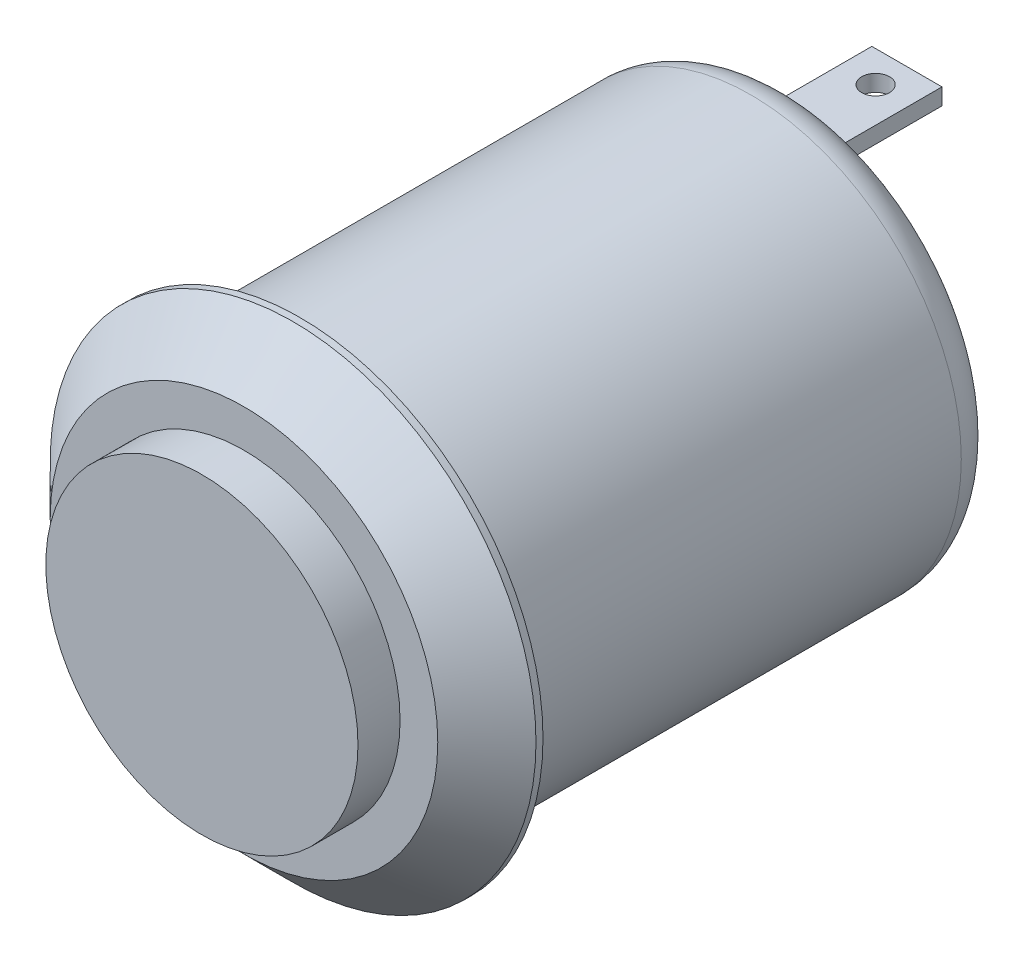
ISO-10303-21;
HEADER;
FILE_DESCRIPTION(('STEP AP214'),'2;1');
FILE_NAME('part.step','',(''),(''),'','','');
FILE_SCHEMA(('AUTOMOTIVE_DESIGN { 1 0 10303 214 1 1 1 1 }'));
ENDSEC;
DATA;
#1=APPLICATION_CONTEXT('core data for automotive mechanical design processes');
#2=APPLICATION_PROTOCOL_DEFINITION('international standard','automotive_design',2000,#1);
#3=PRODUCT_CONTEXT('',#1,'mechanical');
#4=PRODUCT('Part','Part','',(#3));
#5=PRODUCT_RELATED_PRODUCT_CATEGORY('part','',(#4));
#6=PRODUCT_DEFINITION_FORMATION('','',#4);
#7=PRODUCT_DEFINITION_CONTEXT('part definition',#1,'design');
#8=PRODUCT_DEFINITION('design','',#6,#7);
#9=PRODUCT_DEFINITION_SHAPE('','',#8);
#10=(LENGTH_UNIT() NAMED_UNIT(*) SI_UNIT(.MILLI.,.METRE.));
#11=(NAMED_UNIT(*) PLANE_ANGLE_UNIT() SI_UNIT($,.RADIAN.));
#12=(NAMED_UNIT(*) SI_UNIT($,.STERADIAN.) SOLID_ANGLE_UNIT());
#13=UNCERTAINTY_MEASURE_WITH_UNIT(LENGTH_MEASURE(1.E-05),#10,'distance_accuracy_value','');
#14=(GEOMETRIC_REPRESENTATION_CONTEXT(3) GLOBAL_UNCERTAINTY_ASSIGNED_CONTEXT((#13)) GLOBAL_UNIT_ASSIGNED_CONTEXT((#10,
#11,#12)) REPRESENTATION_CONTEXT('',''));
#15=CARTESIAN_POINT('',(0.,0.,0.));
#16=DIRECTION('',(0.,0.,1.));
#17=DIRECTION('',(1.,0.,0.));
#18=AXIS2_PLACEMENT_3D('',#15,#16,#17);
#19=CARTESIAN_POINT('',(0.,0.,-14.));
#20=DIRECTION('',(0.,0.,1.));
#21=DIRECTION('',(1.,0.,0.));
#22=AXIS2_PLACEMENT_3D('',#19,#20,#21);
#23=PLANE('',#22);
#24=DIRECTION('',(0.,1.,0.));
#25=VECTOR('',#24,1.);
#26=CARTESIAN_POINT('',(-1.,4.,-14.));
#27=LINE('',#26,#25);
#28=CARTESIAN_POINT('',(-1.,4.,-14.));
#29=VERTEX_POINT('',#28);
#30=CARTESIAN_POINT('',(-1.,4.47,-14.));
#31=VERTEX_POINT('',#30);
#32=EDGE_CURVE('E122',#29,#31,#27,.T.);
#33=ORIENTED_EDGE('',*,*,#32,.F.);
#34=DIRECTION('',(-1.,0.,0.));
#35=VECTOR('',#34,1.);
#36=CARTESIAN_POINT('',(1.,4.,-14.));
#37=LINE('',#36,#35);
#38=CARTESIAN_POINT('',(1.,4.,-14.));
#39=VERTEX_POINT('',#38);
#40=EDGE_CURVE('E135',#39,#29,#37,.T.);
#41=ORIENTED_EDGE('',*,*,#40,.F.);
#42=DIRECTION('',(0.,-1.,0.));
#43=VECTOR('',#42,1.);
#44=CARTESIAN_POINT('',(1.,4.,-14.));
#45=LINE('',#44,#43);
#46=CARTESIAN_POINT('',(1.,4.47,-14.));
#47=VERTEX_POINT('',#46);
#48=EDGE_CURVE('E144',#47,#39,#45,.T.);
#49=ORIENTED_EDGE('',*,*,#48,.F.);
#50=DIRECTION('',(1.,0.,0.));
#51=VECTOR('',#50,1.);
#52=CARTESIAN_POINT('',(1.,4.47,-14.));
#53=LINE('',#52,#51);
#54=EDGE_CURVE('E125',#31,#47,#53,.T.);
#55=ORIENTED_EDGE('',*,*,#54,.F.);
#56=EDGE_LOOP('',(#33,#41,#49,#55));
#57=FACE_BOUND('',#56,.T.);
#58=CARTESIAN_POINT('',(0.,0.,-14.));
#59=DIRECTION('',(0.,0.,1.));
#60=DIRECTION('',(1.,0.,0.));
#61=AXIS2_PLACEMENT_3D('',#58,#59,#60);
#62=CIRCLE('',#61,4.85);
#63=CARTESIAN_POINT('',(4.85,0.,-14.));
#64=VERTEX_POINT('',#63);
#65=EDGE_CURVE('E11',#64,#64,#62,.F.);
#66=ORIENTED_EDGE('',*,*,#65,.T.);
#67=EDGE_LOOP('',(#66));
#68=FACE_BOUND('',#67,.T.);
#69=DIRECTION('',(0.,-1.,0.));
#70=VECTOR('',#69,1.);
#71=CARTESIAN_POINT('',(1.,-4.,-14.));
#72=LINE('',#71,#70);
#73=CARTESIAN_POINT('',(1.,-4.,-14.));
#74=VERTEX_POINT('',#73);
#75=CARTESIAN_POINT('',(1.,-4.47,-14.));
#76=VERTEX_POINT('',#75);
#77=EDGE_CURVE('E121',#74,#76,#72,.T.);
#78=ORIENTED_EDGE('',*,*,#77,.F.);
#79=DIRECTION('',(1.,0.,0.));
#80=VECTOR('',#79,1.);
#81=CARTESIAN_POINT('',(1.,-4.,-14.));
#82=LINE('',#81,#80);
#83=CARTESIAN_POINT('',(-1.,-4.,-14.));
#84=VERTEX_POINT('',#83);
#85=EDGE_CURVE('E118',#84,#74,#82,.T.);
#86=ORIENTED_EDGE('',*,*,#85,.F.);
#87=DIRECTION('',(0.,1.,0.));
#88=VECTOR('',#87,1.);
#89=CARTESIAN_POINT('',(-1.,-4.,-14.));
#90=LINE('',#89,#88);
#91=CARTESIAN_POINT('',(-1.,-4.47,-14.));
#92=VERTEX_POINT('',#91);
#93=EDGE_CURVE('E56',#92,#84,#90,.T.);
#94=ORIENTED_EDGE('',*,*,#93,.F.);
#95=DIRECTION('',(-1.,0.,0.));
#96=VECTOR('',#95,1.);
#97=CARTESIAN_POINT('',(1.,-4.47,-14.));
#98=LINE('',#97,#96);
#99=EDGE_CURVE('E51',#76,#92,#98,.T.);
#100=ORIENTED_EDGE('',*,*,#99,.F.);
#101=EDGE_LOOP('',(#78,#86,#94,#100));
#102=FACE_BOUND('',#101,.T.);
#103=ADVANCED_FACE('F35',(#57,#68,#102),#23,.F.);
#104=CARTESIAN_POINT('',(0.,0.,-14.));
#105=DIRECTION('',(0.,0.,1.));
#106=DIRECTION('',(1.,0.,0.));
#107=AXIS2_PLACEMENT_3D('',#104,#105,#106);
#108=CYLINDRICAL_SURFACE('',#107,6.);
#109=CARTESIAN_POINT('',(0.,0.,-12.85));
#110=DIRECTION('',(0.,0.,1.));
#111=DIRECTION('',(1.,0.,0.));
#112=AXIS2_PLACEMENT_3D('',#109,#110,#111);
#113=CIRCLE('',#112,6.);
#114=CARTESIAN_POINT('',(6.,0.,-12.85));
#115=VERTEX_POINT('',#114);
#116=EDGE_CURVE('E44',#115,#115,#113,.T.);
#117=ORIENTED_EDGE('',*,*,#116,.T.);
#118=EDGE_LOOP('',(#117));
#119=FACE_BOUND('',#118,.T.);
#120=CARTESIAN_POINT('',(0.,0.,0.));
#121=DIRECTION('',(0.,0.,1.));
#122=DIRECTION('',(1.,0.,0.));
#123=AXIS2_PLACEMENT_3D('',#120,#121,#122);
#124=CIRCLE('',#123,6.);
#125=CARTESIAN_POINT('',(6.,0.,0.));
#126=VERTEX_POINT('',#125);
#127=EDGE_CURVE('E170',#126,#126,#124,.T.);
#128=ORIENTED_EDGE('',*,*,#127,.F.);
#129=EDGE_LOOP('',(#128));
#130=FACE_BOUND('',#129,.T.);
#131=ADVANCED_FACE('F181',(#119,#130),#108,.T.);
#132=CARTESIAN_POINT('',(0.,0.,1.6));
#133=DIRECTION('',(0.,0.,-1.));
#134=DIRECTION('',(-1.,0.,0.));
#135=AXIS2_PLACEMENT_3D('',#132,#133,#134);
#136=CYLINDRICAL_SURFACE('',#135,6.925);
#137=CARTESIAN_POINT('',(0.,0.,0.199999999999992));
#138=DIRECTION('',(0.,0.,1.));
#139=DIRECTION('',(1.,0.,0.));
#140=AXIS2_PLACEMENT_3D('',#137,#138,#139);
#141=CIRCLE('',#140,6.925);
#142=CARTESIAN_POINT('',(6.925,0.,0.199999999999992));
#143=VERTEX_POINT('',#142);
#144=EDGE_CURVE('E167',#143,#143,#141,.F.);
#145=ORIENTED_EDGE('',*,*,#144,.T.);
#146=EDGE_LOOP('',(#145));
#147=FACE_BOUND('',#146,.T.);
#148=CARTESIAN_POINT('',(0.,0.,0.));
#149=DIRECTION('',(0.,0.,1.));
#150=DIRECTION('',(1.,0.,0.));
#151=AXIS2_PLACEMENT_3D('',#148,#149,#150);
#152=CIRCLE('',#151,6.925);
#153=CARTESIAN_POINT('',(6.925,0.,0.));
#154=VERTEX_POINT('',#153);
#155=EDGE_CURVE('E163',#154,#154,#152,.T.);
#156=ORIENTED_EDGE('',*,*,#155,.T.);
#157=EDGE_LOOP('',(#156));
#158=FACE_BOUND('',#157,.T.);
#159=ADVANCED_FACE('F205',(#147,#158),#136,.T.);
#160=CARTESIAN_POINT('',(0.,0.,1.6));
#161=DIRECTION('',(0.,0.,1.));
#162=DIRECTION('',(1.,0.,0.));
#163=AXIS2_PLACEMENT_3D('',#160,#161,#162);
#164=PLANE('',#163);
#165=CARTESIAN_POINT('',(0.,0.,1.6));
#166=DIRECTION('',(0.,0.,1.));
#167=DIRECTION('',(1.,0.,0.));
#168=AXIS2_PLACEMENT_3D('',#165,#166,#167);
#169=CIRCLE('',#168,4.45);
#170=CARTESIAN_POINT('',(4.45,0.,1.6));
#171=VERTEX_POINT('',#170);
#172=EDGE_CURVE('E164',#171,#171,#169,.T.);
#173=ORIENTED_EDGE('',*,*,#172,.F.);
#174=EDGE_LOOP('',(#173));
#175=FACE_BOUND('',#174,.T.);
#176=CARTESIAN_POINT('',(0.,0.,1.6));
#177=DIRECTION('',(0.,0.,1.));
#178=DIRECTION('',(1.,0.,0.));
#179=AXIS2_PLACEMENT_3D('',#176,#177,#178);
#180=CIRCLE('',#179,5.52499999999999);
#181=CARTESIAN_POINT('',(5.52499999999999,0.,1.6));
#182=VERTEX_POINT('',#181);
#183=EDGE_CURVE('E173',#182,#182,#180,.T.);
#184=ORIENTED_EDGE('',*,*,#183,.T.);
#185=EDGE_LOOP('',(#184));
#186=FACE_BOUND('',#185,.T.);
#187=ADVANCED_FACE('F223',(#175,#186),#164,.T.);
#188=CARTESIAN_POINT('',(0.,0.,0.));
#189=DIRECTION('',(0.,0.,1.));
#190=DIRECTION('',(1.,0.,0.));
#191=AXIS2_PLACEMENT_3D('',#188,#189,#190);
#192=PLANE('',#191);
#193=ORIENTED_EDGE('',*,*,#127,.T.);
#194=EDGE_LOOP('',(#193));
#195=FACE_BOUND('',#194,.T.);
#196=ORIENTED_EDGE('',*,*,#155,.F.);
#197=EDGE_LOOP('',(#196));
#198=FACE_BOUND('',#197,.T.);
#199=ADVANCED_FACE('F215',(#195,#198),#192,.F.);
#200=CARTESIAN_POINT('',(0.,0.,1.6));
#201=DIRECTION('',(0.,0.,-1.));
#202=DIRECTION('',(-1.,0.,0.));
#203=AXIS2_PLACEMENT_3D('',#200,#201,#202);
#204=CONICAL_SURFACE('',#203,5.52499999999999,0.785398163397448);
#205=ORIENTED_EDGE('',*,*,#144,.F.);
#206=EDGE_LOOP('',(#205));
#207=FACE_BOUND('',#206,.T.);
#208=ORIENTED_EDGE('',*,*,#183,.F.);
#209=EDGE_LOOP('',(#208));
#210=FACE_BOUND('',#209,.T.);
#211=ADVANCED_FACE('F211',(#207,#210),#204,.T.);
#212=CARTESIAN_POINT('',(0.,0.,2.8));
#213=DIRECTION('',(0.,0.,-1.));
#214=DIRECTION('',(-1.,0.,0.));
#215=AXIS2_PLACEMENT_3D('',#212,#213,#214);
#216=CYLINDRICAL_SURFACE('',#215,4.45);
#217=CARTESIAN_POINT('',(0.,0.,2.8));
#218=DIRECTION('',(0.,0.,1.));
#219=DIRECTION('',(1.,0.,0.));
#220=AXIS2_PLACEMENT_3D('',#217,#218,#219);
#221=CIRCLE('',#220,4.45);
#222=CARTESIAN_POINT('',(4.45,0.,2.8));
#223=VERTEX_POINT('',#222);
#224=EDGE_CURVE('E160',#223,#223,#221,.T.);
#225=ORIENTED_EDGE('',*,*,#224,.F.);
#226=EDGE_LOOP('',(#225));
#227=FACE_BOUND('',#226,.T.);
#228=ORIENTED_EDGE('',*,*,#172,.T.);
#229=EDGE_LOOP('',(#228));
#230=FACE_BOUND('',#229,.T.);
#231=ADVANCED_FACE('F195',(#227,#230),#216,.T.);
#232=CARTESIAN_POINT('',(0.,0.,2.8));
#233=DIRECTION('',(0.,0.,1.));
#234=DIRECTION('',(1.,0.,0.));
#235=AXIS2_PLACEMENT_3D('',#232,#233,#234);
#236=PLANE('',#235);
#237=ORIENTED_EDGE('',*,*,#224,.T.);
#238=EDGE_LOOP('',(#237));
#239=FACE_BOUND('',#238,.T.);
#240=ADVANCED_FACE('F186',(#239),#236,.T.);
#241=CARTESIAN_POINT('',(0.,0.,-12.85));
#242=DIRECTION('',(0.,0.,1.));
#243=DIRECTION('',(1.,0.,0.));
#244=AXIS2_PLACEMENT_3D('',#241,#242,#243);
#245=TOROIDAL_SURFACE('',#244,4.85,1.15);
#246=ORIENTED_EDGE('',*,*,#65,.F.);
#247=EDGE_LOOP('',(#246));
#248=FACE_BOUND('',#247,.T.);
#249=ORIENTED_EDGE('',*,*,#116,.F.);
#250=EDGE_LOOP('',(#249));
#251=FACE_BOUND('',#250,.T.);
#252=ADVANCED_FACE('F37',(#248,#251),#245,.T.);
#253=CARTESIAN_POINT('',(-1.,4.,-17.3));
#254=DIRECTION('',(1.,0.,0.));
#255=DIRECTION('',(0.,0.,-1.));
#256=AXIS2_PLACEMENT_3D('',#253,#254,#255);
#257=PLANE('',#256);
#258=ORIENTED_EDGE('',*,*,#32,.T.);
#259=DIRECTION('',(0.,0.,1.));
#260=VECTOR('',#259,1.);
#261=CARTESIAN_POINT('',(-1.,4.47,-17.3));
#262=LINE('',#261,#260);
#263=CARTESIAN_POINT('',(-1.,4.47,-17.3));
#264=VERTEX_POINT('',#263);
#265=EDGE_CURVE('E157',#264,#31,#262,.T.);
#266=ORIENTED_EDGE('',*,*,#265,.F.);
#267=DIRECTION('',(0.,1.,0.));
#268=VECTOR('',#267,1.);
#269=CARTESIAN_POINT('',(-1.,4.,-17.3));
#270=LINE('',#269,#268);
#271=CARTESIAN_POINT('',(-1.,4.,-17.3));
#272=VERTEX_POINT('',#271);
#273=EDGE_CURVE('E131',#272,#264,#270,.T.);
#274=ORIENTED_EDGE('',*,*,#273,.F.);
#275=DIRECTION('',(0.,0.,1.));
#276=VECTOR('',#275,1.);
#277=CARTESIAN_POINT('',(-1.,4.,-17.3));
#278=LINE('',#277,#276);
#279=EDGE_CURVE('E140',#272,#29,#278,.T.);
#280=ORIENTED_EDGE('',*,*,#279,.T.);
#281=EDGE_LOOP('',(#258,#266,#274,#280));
#282=FACE_BOUND('',#281,.T.);
#283=ADVANCED_FACE('F185',(#282),#257,.F.);
#284=CARTESIAN_POINT('',(1.,4.47,-17.3));
#285=DIRECTION('',(0.,-1.,0.));
#286=DIRECTION('',(0.,0.,-1.));
#287=AXIS2_PLACEMENT_3D('',#284,#285,#286);
#288=PLANE('',#287);
#289=CARTESIAN_POINT('',(0.,4.47,-16.4080050754331));
#290=DIRECTION('',(0.,1.,0.));
#291=DIRECTION('',(0.,0.,1.));
#292=AXIS2_PLACEMENT_3D('',#289,#290,#291);
#293=CIRCLE('',#292,0.395429062144714);
#294=CARTESIAN_POINT('',(0.,4.47,-16.0125760132884));
#295=VERTEX_POINT('',#294);
#296=EDGE_CURVE('E279',#295,#295,#293,.T.);
#297=ORIENTED_EDGE('',*,*,#296,.F.);
#298=EDGE_LOOP('',(#297));
#299=FACE_BOUND('',#298,.T.);
#300=ORIENTED_EDGE('',*,*,#54,.T.);
#301=DIRECTION('',(0.,0.,1.));
#302=VECTOR('',#301,1.);
#303=CARTESIAN_POINT('',(1.,4.47,-17.3));
#304=LINE('',#303,#302);
#305=CARTESIAN_POINT('',(1.,4.47,-17.3));
#306=VERTEX_POINT('',#305);
#307=EDGE_CURVE('E154',#306,#47,#304,.T.);
#308=ORIENTED_EDGE('',*,*,#307,.F.);
#309=DIRECTION('',(1.,0.,0.));
#310=VECTOR('',#309,1.);
#311=CARTESIAN_POINT('',(1.,4.47,-17.3));
#312=LINE('',#311,#310);
#313=EDGE_CURVE('E134',#264,#306,#312,.T.);
#314=ORIENTED_EDGE('',*,*,#313,.F.);
#315=ORIENTED_EDGE('',*,*,#265,.T.);
#316=EDGE_LOOP('',(#300,#308,#314,#315));
#317=FACE_BOUND('',#316,.T.);
#318=ADVANCED_FACE('F192',(#299,#317),#288,.F.);
#319=CARTESIAN_POINT('',(1.,4.,-17.3));
#320=DIRECTION('',(-1.,0.,0.));
#321=DIRECTION('',(0.,0.,1.));
#322=AXIS2_PLACEMENT_3D('',#319,#320,#321);
#323=PLANE('',#322);
#324=ORIENTED_EDGE('',*,*,#48,.T.);
#325=DIRECTION('',(0.,0.,1.));
#326=VECTOR('',#325,1.);
#327=CARTESIAN_POINT('',(1.,4.,-17.3));
#328=LINE('',#327,#326);
#329=CARTESIAN_POINT('',(1.,4.,-17.3));
#330=VERTEX_POINT('',#329);
#331=EDGE_CURVE('E151',#330,#39,#328,.T.);
#332=ORIENTED_EDGE('',*,*,#331,.F.);
#333=DIRECTION('',(0.,-1.,0.));
#334=VECTOR('',#333,1.);
#335=CARTESIAN_POINT('',(1.,4.,-17.3));
#336=LINE('',#335,#334);
#337=EDGE_CURVE('E137',#306,#330,#336,.T.);
#338=ORIENTED_EDGE('',*,*,#337,.F.);
#339=ORIENTED_EDGE('',*,*,#307,.T.);
#340=EDGE_LOOP('',(#324,#332,#338,#339));
#341=FACE_BOUND('',#340,.T.);
#342=ADVANCED_FACE('F240',(#341),#323,.F.);
#343=CARTESIAN_POINT('',(1.,4.,-17.3));
#344=DIRECTION('',(0.,1.,0.));
#345=DIRECTION('',(0.,0.,1.));
#346=AXIS2_PLACEMENT_3D('',#343,#344,#345);
#347=PLANE('',#346);
#348=CARTESIAN_POINT('',(0.,4.,-16.4080050754331));
#349=DIRECTION('',(0.,1.,0.));
#350=DIRECTION('',(0.,0.,1.));
#351=AXIS2_PLACEMENT_3D('',#348,#349,#350);
#352=CIRCLE('',#351,0.395429062144714);
#353=CARTESIAN_POINT('',(0.,4.,-16.0125760132884));
#354=VERTEX_POINT('',#353);
#355=EDGE_CURVE('E282',#354,#354,#352,.T.);
#356=ORIENTED_EDGE('',*,*,#355,.T.);
#357=EDGE_LOOP('',(#356));
#358=FACE_BOUND('',#357,.T.);
#359=ORIENTED_EDGE('',*,*,#40,.T.);
#360=ORIENTED_EDGE('',*,*,#279,.F.);
#361=DIRECTION('',(-1.,0.,0.));
#362=VECTOR('',#361,1.);
#363=CARTESIAN_POINT('',(1.,4.,-17.3));
#364=LINE('',#363,#362);
#365=EDGE_CURVE('E139',#330,#272,#364,.T.);
#366=ORIENTED_EDGE('',*,*,#365,.F.);
#367=ORIENTED_EDGE('',*,*,#331,.T.);
#368=EDGE_LOOP('',(#359,#360,#366,#367));
#369=FACE_BOUND('',#368,.T.);
#370=ADVANCED_FACE('F244',(#358,#369),#347,.F.);
#371=CARTESIAN_POINT('',(0.,0.,-17.3));
#372=DIRECTION('',(0.,0.,1.));
#373=DIRECTION('',(1.,0.,0.));
#374=AXIS2_PLACEMENT_3D('',#371,#372,#373);
#375=PLANE('',#374);
#376=ORIENTED_EDGE('',*,*,#273,.T.);
#377=ORIENTED_EDGE('',*,*,#313,.T.);
#378=ORIENTED_EDGE('',*,*,#337,.T.);
#379=ORIENTED_EDGE('',*,*,#365,.T.);
#380=EDGE_LOOP('',(#376,#377,#378,#379));
#381=FACE_BOUND('',#380,.T.);
#382=ADVANCED_FACE('F248',(#381),#375,.F.);
#383=CARTESIAN_POINT('',(1.,-4.,-17.3));
#384=DIRECTION('',(-1.,0.,0.));
#385=DIRECTION('',(0.,0.,1.));
#386=AXIS2_PLACEMENT_3D('',#383,#384,#385);
#387=PLANE('',#386);
#388=ORIENTED_EDGE('',*,*,#77,.T.);
#389=DIRECTION('',(0.,0.,1.));
#390=VECTOR('',#389,1.);
#391=CARTESIAN_POINT('',(1.,-4.47,-17.3));
#392=LINE('',#391,#390);
#393=CARTESIAN_POINT('',(1.,-4.47,-17.3));
#394=VERTEX_POINT('',#393);
#395=EDGE_CURVE('E102',#394,#76,#392,.T.);
#396=ORIENTED_EDGE('',*,*,#395,.F.);
#397=DIRECTION('',(0.,-1.,0.));
#398=VECTOR('',#397,1.);
#399=CARTESIAN_POINT('',(1.,-4.,-17.3));
#400=LINE('',#399,#398);
#401=CARTESIAN_POINT('',(1.,-4.,-17.3));
#402=VERTEX_POINT('',#401);
#403=EDGE_CURVE('E109',#402,#394,#400,.T.);
#404=ORIENTED_EDGE('',*,*,#403,.F.);
#405=DIRECTION('',(0.,0.,1.));
#406=VECTOR('',#405,1.);
#407=CARTESIAN_POINT('',(1.,-4.,-17.3));
#408=LINE('',#407,#406);
#409=EDGE_CURVE('E291',#402,#74,#408,.T.);
#410=ORIENTED_EDGE('',*,*,#409,.T.);
#411=EDGE_LOOP('',(#388,#396,#404,#410));
#412=FACE_BOUND('',#411,.T.);
#413=ADVANCED_FACE('F120',(#412),#387,.F.);
#414=CARTESIAN_POINT('',(1.,-4.47,-17.3));
#415=DIRECTION('',(0.,1.,0.));
#416=DIRECTION('',(0.,0.,1.));
#417=AXIS2_PLACEMENT_3D('',#414,#415,#416);
#418=PLANE('',#417);
#419=CARTESIAN_POINT('',(0.,-4.47,-16.4080050754331));
#420=DIRECTION('',(0.,1.,0.));
#421=DIRECTION('',(0.,0.,1.));
#422=AXIS2_PLACEMENT_3D('',#419,#420,#421);
#423=CIRCLE('',#422,0.395429062144714);
#424=CARTESIAN_POINT('',(0.,-4.47,-16.0125760132884));
#425=VERTEX_POINT('',#424);
#426=EDGE_CURVE('E283',#425,#425,#423,.T.);
#427=ORIENTED_EDGE('',*,*,#426,.T.);
#428=EDGE_LOOP('',(#427));
#429=FACE_BOUND('',#428,.T.);
#430=ORIENTED_EDGE('',*,*,#99,.T.);
#431=DIRECTION('',(0.,0.,1.));
#432=VECTOR('',#431,1.);
#433=CARTESIAN_POINT('',(-1.,-4.47,-17.3));
#434=LINE('',#433,#432);
#435=CARTESIAN_POINT('',(-1.,-4.47,-17.3));
#436=VERTEX_POINT('',#435);
#437=EDGE_CURVE('E105',#436,#92,#434,.T.);
#438=ORIENTED_EDGE('',*,*,#437,.F.);
#439=DIRECTION('',(-1.,0.,0.));
#440=VECTOR('',#439,1.);
#441=CARTESIAN_POINT('',(1.,-4.47,-17.3));
#442=LINE('',#441,#440);
#443=EDGE_CURVE('E98',#394,#436,#442,.T.);
#444=ORIENTED_EDGE('',*,*,#443,.F.);
#445=ORIENTED_EDGE('',*,*,#395,.T.);
#446=EDGE_LOOP('',(#430,#438,#444,#445));
#447=FACE_BOUND('',#446,.T.);
#448=ADVANCED_FACE('F100',(#429,#447),#418,.F.);
#449=CARTESIAN_POINT('',(-1.,-4.,-17.3));
#450=DIRECTION('',(1.,0.,0.));
#451=DIRECTION('',(0.,0.,-1.));
#452=AXIS2_PLACEMENT_3D('',#449,#450,#451);
#453=PLANE('',#452);
#454=ORIENTED_EDGE('',*,*,#93,.T.);
#455=DIRECTION('',(0.,0.,1.));
#456=VECTOR('',#455,1.);
#457=CARTESIAN_POINT('',(-1.,-4.,-17.3));
#458=LINE('',#457,#456);
#459=CARTESIAN_POINT('',(-1.,-4.,-17.3));
#460=VERTEX_POINT('',#459);
#461=EDGE_CURVE('E127',#460,#84,#458,.T.);
#462=ORIENTED_EDGE('',*,*,#461,.F.);
#463=DIRECTION('',(0.,1.,0.));
#464=VECTOR('',#463,1.);
#465=CARTESIAN_POINT('',(-1.,-4.,-17.3));
#466=LINE('',#465,#464);
#467=EDGE_CURVE('E108',#436,#460,#466,.T.);
#468=ORIENTED_EDGE('',*,*,#467,.F.);
#469=ORIENTED_EDGE('',*,*,#437,.T.);
#470=EDGE_LOOP('',(#454,#462,#468,#469));
#471=FACE_BOUND('',#470,.T.);
#472=ADVANCED_FACE('F257',(#471),#453,.F.);
#473=CARTESIAN_POINT('',(1.,-4.,-17.3));
#474=DIRECTION('',(0.,-1.,0.));
#475=DIRECTION('',(0.,0.,-1.));
#476=AXIS2_PLACEMENT_3D('',#473,#474,#475);
#477=PLANE('',#476);
#478=CARTESIAN_POINT('',(0.,-4.,-16.4080050754331));
#479=DIRECTION('',(0.,-1.,0.));
#480=DIRECTION('',(0.,0.,-1.));
#481=AXIS2_PLACEMENT_3D('',#478,#479,#480);
#482=CIRCLE('',#481,0.395429062144714);
#483=CARTESIAN_POINT('',(0.,-4.,-16.8034341375778));
#484=VERTEX_POINT('',#483);
#485=EDGE_CURVE('E39',#484,#484,#482,.T.);
#486=ORIENTED_EDGE('',*,*,#485,.T.);
#487=EDGE_LOOP('',(#486));
#488=FACE_BOUND('',#487,.T.);
#489=ORIENTED_EDGE('',*,*,#85,.T.);
#490=ORIENTED_EDGE('',*,*,#409,.F.);
#491=DIRECTION('',(1.,0.,0.));
#492=VECTOR('',#491,1.);
#493=CARTESIAN_POINT('',(1.,-4.,-17.3));
#494=LINE('',#493,#492);
#495=EDGE_CURVE('E114',#460,#402,#494,.T.);
#496=ORIENTED_EDGE('',*,*,#495,.F.);
#497=ORIENTED_EDGE('',*,*,#461,.T.);
#498=EDGE_LOOP('',(#489,#490,#496,#497));
#499=FACE_BOUND('',#498,.T.);
#500=ADVANCED_FACE('F261',(#488,#499),#477,.F.);
#501=CARTESIAN_POINT('',(0.,0.,-17.3));
#502=DIRECTION('',(0.,0.,-1.));
#503=DIRECTION('',(-1.,0.,0.));
#504=AXIS2_PLACEMENT_3D('',#501,#502,#503);
#505=PLANE('',#504);
#506=ORIENTED_EDGE('',*,*,#403,.T.);
#507=ORIENTED_EDGE('',*,*,#443,.T.);
#508=ORIENTED_EDGE('',*,*,#467,.T.);
#509=ORIENTED_EDGE('',*,*,#495,.T.);
#510=EDGE_LOOP('',(#506,#507,#508,#509));
#511=FACE_BOUND('',#510,.T.);
#512=ADVANCED_FACE('F112',(#511),#505,.T.);
#513=CARTESIAN_POINT('',(0.,-6.925,-16.4080050754331));
#514=DIRECTION('',(0.,1.,0.));
#515=DIRECTION('',(0.,0.,1.));
#516=AXIS2_PLACEMENT_3D('',#513,#514,#515);
#517=CYLINDRICAL_SURFACE('',#516,0.395429062144714);
#518=ORIENTED_EDGE('',*,*,#485,.F.);
#519=EDGE_LOOP('',(#518));
#520=FACE_BOUND('',#519,.T.);
#521=ORIENTED_EDGE('',*,*,#426,.F.);
#522=EDGE_LOOP('',(#521));
#523=FACE_BOUND('',#522,.T.);
#524=ADVANCED_FACE('F268',(#520,#523),#517,.F.);
#525=ORIENTED_EDGE('',*,*,#296,.T.);
#526=EDGE_LOOP('',(#525));
#527=FACE_BOUND('',#526,.T.);
#528=ORIENTED_EDGE('',*,*,#355,.F.);
#529=EDGE_LOOP('',(#528));
#530=FACE_BOUND('',#529,.T.);
#531=ADVANCED_FACE('F269',(#527,#530),#517,.F.);
#532=CLOSED_SHELL('',(#103,#131,#159,#187,#199,#211,#231,#240,#252,#283,#318,#342,#370,#382,
#413,#448,#472,#500,#512,#524,#531));
#533=MANIFOLD_SOLID_BREP('B2',#532);
#534=ADVANCED_BREP_SHAPE_REPRESENTATION('',(#18,#533),#14);
#535=SHAPE_DEFINITION_REPRESENTATION(#9,#534);
ENDSEC;
END-ISO-10303-21;
